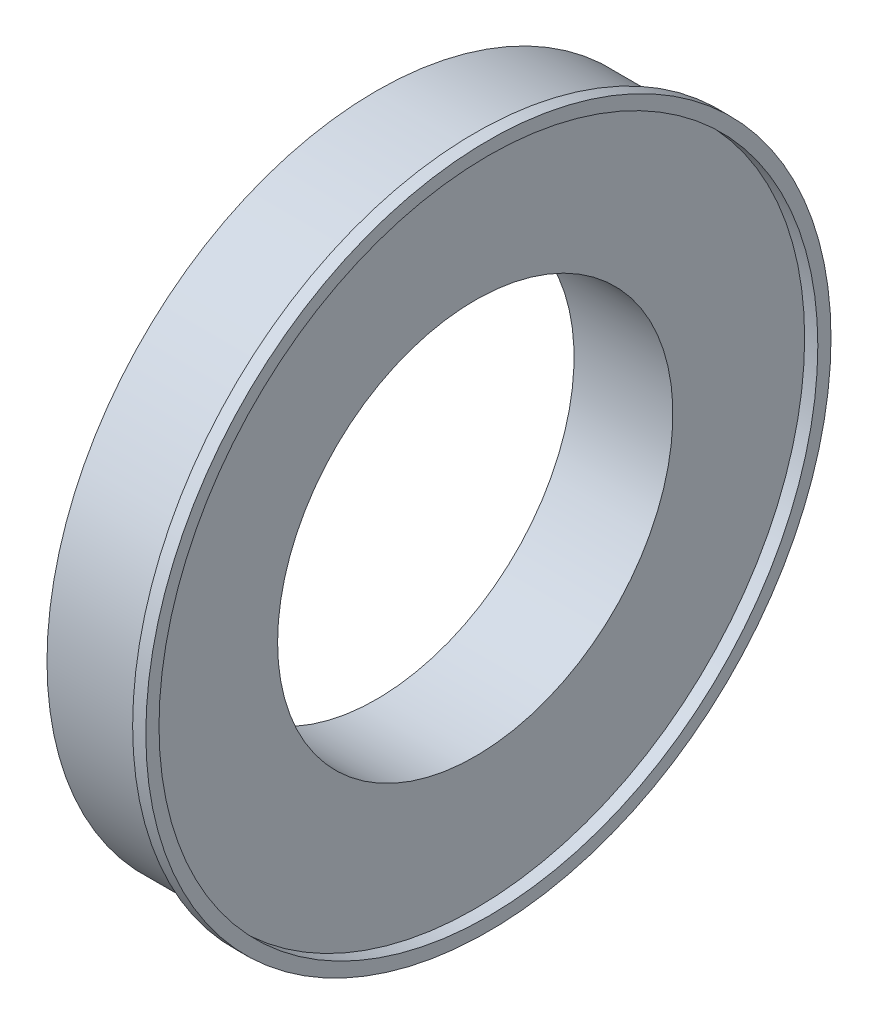
ISO-10303-21;
HEADER;
FILE_DESCRIPTION(('STEP AP214'),'2;1');
FILE_NAME('part.step','',(''),(''),'','','');
FILE_SCHEMA(('AUTOMOTIVE_DESIGN { 1 0 10303 214 1 1 1 1 }'));
ENDSEC;
DATA;
#1=APPLICATION_CONTEXT('core data for automotive mechanical design processes');
#2=APPLICATION_PROTOCOL_DEFINITION('international standard','automotive_design',2000,#1);
#3=PRODUCT_CONTEXT('',#1,'mechanical');
#4=PRODUCT('Part','Part','',(#3));
#5=PRODUCT_RELATED_PRODUCT_CATEGORY('part','',(#4));
#6=PRODUCT_DEFINITION_FORMATION('','',#4);
#7=PRODUCT_DEFINITION_CONTEXT('part definition',#1,'design');
#8=PRODUCT_DEFINITION('design','',#6,#7);
#9=PRODUCT_DEFINITION_SHAPE('','',#8);
#10=(LENGTH_UNIT() NAMED_UNIT(*) SI_UNIT(.MILLI.,.METRE.));
#11=(NAMED_UNIT(*) PLANE_ANGLE_UNIT() SI_UNIT($,.RADIAN.));
#12=(NAMED_UNIT(*) SI_UNIT($,.STERADIAN.) SOLID_ANGLE_UNIT());
#13=UNCERTAINTY_MEASURE_WITH_UNIT(LENGTH_MEASURE(1.E-05),#10,'distance_accuracy_value','');
#14=(GEOMETRIC_REPRESENTATION_CONTEXT(3) GLOBAL_UNCERTAINTY_ASSIGNED_CONTEXT((#13)) GLOBAL_UNIT_ASSIGNED_CONTEXT((#10,
#11,#12)) REPRESENTATION_CONTEXT('',''));
#15=CARTESIAN_POINT('',(0.,0.,0.));
#16=DIRECTION('',(0.,0.,1.));
#17=DIRECTION('',(1.,0.,0.));
#18=AXIS2_PLACEMENT_3D('',#15,#16,#17);
#19=CARTESIAN_POINT('',(21.59,0.,0.));
#20=DIRECTION('',(1.,0.,0.));
#21=DIRECTION('',(0.,0.,-1.));
#22=AXIS2_PLACEMENT_3D('',#19,#20,#21);
#23=PLANE('',#22);
#24=CARTESIAN_POINT('',(21.59,0.,0.));
#25=DIRECTION('',(1.,0.,0.));
#26=DIRECTION('',(0.,0.,-1.));
#27=AXIS2_PLACEMENT_3D('',#24,#25,#26);
#28=CIRCLE('',#27,66.04);
#29=CARTESIAN_POINT('',(21.59,0.,-66.04));
#30=VERTEX_POINT('',#29);
#31=EDGE_CURVE('E11',#30,#30,#28,.T.);
#32=ORIENTED_EDGE('',*,*,#31,.T.);
#33=EDGE_LOOP('',(#32));
#34=FACE_BOUND('',#33,.T.);
#35=CARTESIAN_POINT('',(21.59,0.,0.));
#36=DIRECTION('',(1.,0.,0.));
#37=DIRECTION('',(0.,0.,-1.));
#38=AXIS2_PLACEMENT_3D('',#35,#36,#37);
#39=CIRCLE('',#38,63.5);
#40=CARTESIAN_POINT('',(21.59,0.,-63.5));
#41=VERTEX_POINT('',#40);
#42=EDGE_CURVE('E54',#41,#41,#39,.T.);
#43=ORIENTED_EDGE('',*,*,#42,.F.);
#44=EDGE_LOOP('',(#43));
#45=FACE_BOUND('',#44,.T.);
#46=ADVANCED_FACE('F43',(#34,#45),#23,.T.);
#47=CARTESIAN_POINT('',(19.05,0.,0.));
#48=DIRECTION('',(1.,0.,0.));
#49=DIRECTION('',(0.,0.,-1.));
#50=AXIS2_PLACEMENT_3D('',#47,#48,#49);
#51=PLANE('',#50);
#52=CARTESIAN_POINT('',(19.05,0.,0.));
#53=DIRECTION('',(1.,0.,0.));
#54=DIRECTION('',(0.,0.,-1.));
#55=AXIS2_PLACEMENT_3D('',#52,#53,#54);
#56=CIRCLE('',#55,66.04);
#57=CARTESIAN_POINT('',(19.05,0.,-66.04));
#58=VERTEX_POINT('',#57);
#59=EDGE_CURVE('E47',#58,#58,#56,.T.);
#60=ORIENTED_EDGE('',*,*,#59,.F.);
#61=EDGE_LOOP('',(#60));
#62=FACE_BOUND('',#61,.T.);
#63=CARTESIAN_POINT('',(19.05,0.,0.));
#64=DIRECTION('',(1.,0.,0.));
#65=DIRECTION('',(0.,0.,-1.));
#66=AXIS2_PLACEMENT_3D('',#63,#64,#65);
#67=CIRCLE('',#66,63.5);
#68=CARTESIAN_POINT('',(19.05,0.,-63.5));
#69=VERTEX_POINT('',#68);
#70=EDGE_CURVE('E56',#69,#69,#67,.T.);
#71=ORIENTED_EDGE('',*,*,#70,.T.);
#72=EDGE_LOOP('',(#71));
#73=FACE_BOUND('',#72,.T.);
#74=ADVANCED_FACE('F66',(#62,#73),#51,.F.);
#75=CARTESIAN_POINT('',(21.59,0.,0.));
#76=DIRECTION('',(-1.,0.,0.));
#77=DIRECTION('',(0.,0.,1.));
#78=AXIS2_PLACEMENT_3D('',#75,#76,#77);
#79=CYLINDRICAL_SURFACE('',#78,66.04);
#80=ORIENTED_EDGE('',*,*,#31,.F.);
#81=EDGE_LOOP('',(#80));
#82=FACE_BOUND('',#81,.T.);
#83=ORIENTED_EDGE('',*,*,#59,.T.);
#84=EDGE_LOOP('',(#83));
#85=FACE_BOUND('',#84,.T.);
#86=ADVANCED_FACE('F45',(#82,#85),#79,.T.);
#87=CARTESIAN_POINT('',(21.59,0.,0.));
#88=DIRECTION('',(-1.,0.,0.));
#89=DIRECTION('',(0.,0.,1.));
#90=AXIS2_PLACEMENT_3D('',#87,#88,#89);
#91=CYLINDRICAL_SURFACE('',#90,63.5);
#92=ORIENTED_EDGE('',*,*,#42,.T.);
#93=EDGE_LOOP('',(#92));
#94=FACE_BOUND('',#93,.T.);
#95=ORIENTED_EDGE('',*,*,#70,.F.);
#96=EDGE_LOOP('',(#95));
#97=FACE_BOUND('',#96,.T.);
#98=ADVANCED_FACE('F62',(#94,#97),#91,.F.);
#99=CLOSED_SHELL('',(#46,#74,#86,#98));
#100=MANIFOLD_SOLID_BREP('B2',#99);
#101=CARTESIAN_POINT('',(19.05,0.,0.));
#102=DIRECTION('',(1.,0.,0.));
#103=DIRECTION('',(0.,0.,-1.));
#104=AXIS2_PLACEMENT_3D('',#101,#102,#103);
#105=PLANE('',#104);
#106=CARTESIAN_POINT('',(19.05,0.,0.));
#107=DIRECTION('',(1.,0.,0.));
#108=DIRECTION('',(0.,0.,-1.));
#109=AXIS2_PLACEMENT_3D('',#106,#107,#108);
#110=CIRCLE('',#109,63.5);
#111=CARTESIAN_POINT('',(19.05,0.,63.5));
#112=VERTEX_POINT('',#111);
#113=EDGE_CURVE('E42',#112,#112,#110,.T.);
#114=ORIENTED_EDGE('',*,*,#113,.T.);
#115=EDGE_LOOP('',(#114));
#116=FACE_BOUND('',#115,.T.);
#117=CARTESIAN_POINT('',(19.05,0.,0.));
#118=DIRECTION('',(1.,0.,0.));
#119=DIRECTION('',(0.,0.,-1.));
#120=AXIS2_PLACEMENT_3D('',#117,#118,#119);
#121=CIRCLE('',#120,38.1);
#122=CARTESIAN_POINT('',(19.05,0.,38.1));
#123=VERTEX_POINT('',#122);
#124=EDGE_CURVE('E118',#123,#123,#121,.T.);
#125=ORIENTED_EDGE('',*,*,#124,.F.);
#126=EDGE_LOOP('',(#125));
#127=FACE_BOUND('',#126,.T.);
#128=ADVANCED_FACE('F107',(#116,#127),#105,.T.);
#129=CARTESIAN_POINT('',(0.,0.,0.));
#130=DIRECTION('',(1.,0.,0.));
#131=DIRECTION('',(0.,0.,-1.));
#132=AXIS2_PLACEMENT_3D('',#129,#130,#131);
#133=PLANE('',#132);
#134=CARTESIAN_POINT('',(0.,0.,0.));
#135=DIRECTION('',(1.,0.,0.));
#136=DIRECTION('',(0.,0.,-1.));
#137=AXIS2_PLACEMENT_3D('',#134,#135,#136);
#138=CIRCLE('',#137,63.5);
#139=CARTESIAN_POINT('',(0.,0.,63.5));
#140=VERTEX_POINT('',#139);
#141=EDGE_CURVE('E111',#140,#140,#138,.T.);
#142=ORIENTED_EDGE('',*,*,#141,.F.);
#143=EDGE_LOOP('',(#142));
#144=FACE_BOUND('',#143,.T.);
#145=CARTESIAN_POINT('',(0.,0.,0.));
#146=DIRECTION('',(1.,0.,0.));
#147=DIRECTION('',(0.,0.,-1.));
#148=AXIS2_PLACEMENT_3D('',#145,#146,#147);
#149=CIRCLE('',#148,38.1);
#150=CARTESIAN_POINT('',(0.,0.,38.1));
#151=VERTEX_POINT('',#150);
#152=EDGE_CURVE('E120',#151,#151,#149,.T.);
#153=ORIENTED_EDGE('',*,*,#152,.T.);
#154=EDGE_LOOP('',(#153));
#155=FACE_BOUND('',#154,.T.);
#156=ADVANCED_FACE('F130',(#144,#155),#133,.F.);
#157=CARTESIAN_POINT('',(19.05,0.,0.));
#158=DIRECTION('',(-1.,0.,0.));
#159=DIRECTION('',(0.,0.,1.));
#160=AXIS2_PLACEMENT_3D('',#157,#158,#159);
#161=CYLINDRICAL_SURFACE('',#160,63.5);
#162=CARTESIAN_POINT('',(19.05,0.,63.5));
#163=CARTESIAN_POINT('',(18.8515625,0.,63.5));
#164=CARTESIAN_POINT('',(18.653125,0.,63.5));
#165=CARTESIAN_POINT('',(18.25625,0.,63.5));
#166=CARTESIAN_POINT('',(18.0578125,0.,63.5));
#167=CARTESIAN_POINT('',(17.6609375,0.,63.5));
#168=CARTESIAN_POINT('',(17.4625,0.,63.5));
#169=CARTESIAN_POINT('',(17.065625,0.,63.5));
#170=CARTESIAN_POINT('',(16.8671875,0.,63.5));
#171=CARTESIAN_POINT('',(16.4703125,0.,63.5));
#172=CARTESIAN_POINT('',(16.271875,0.,63.5));
#173=CARTESIAN_POINT('',(15.875,0.,63.5));
#174=CARTESIAN_POINT('',(15.6765625,0.,63.5));
#175=CARTESIAN_POINT('',(15.2796875,0.,63.5));
#176=CARTESIAN_POINT('',(15.08125,0.,63.5));
#177=CARTESIAN_POINT('',(14.684375,0.,63.5));
#178=CARTESIAN_POINT('',(14.4859375,0.,63.5));
#179=CARTESIAN_POINT('',(14.0890625,0.,63.5));
#180=CARTESIAN_POINT('',(13.890625,0.,63.5));
#181=CARTESIAN_POINT('',(13.49375,0.,63.5));
#182=CARTESIAN_POINT('',(13.2953125,0.,63.5));
#183=CARTESIAN_POINT('',(12.8984375,0.,63.5));
#184=CARTESIAN_POINT('',(12.7,0.,63.5));
#185=CARTESIAN_POINT('',(12.303125,0.,63.5));
#186=CARTESIAN_POINT('',(12.1046875,0.,63.5));
#187=CARTESIAN_POINT('',(11.7078125,0.,63.5));
#188=CARTESIAN_POINT('',(11.509375,0.,63.5));
#189=CARTESIAN_POINT('',(11.1125,0.,63.5));
#190=CARTESIAN_POINT('',(10.9140625,0.,63.5));
#191=CARTESIAN_POINT('',(10.5171875,0.,63.5));
#192=CARTESIAN_POINT('',(10.31875,0.,63.5));
#193=CARTESIAN_POINT('',(9.921875,0.,63.5));
#194=CARTESIAN_POINT('',(9.7234375,0.,63.5));
#195=CARTESIAN_POINT('',(9.3265625,0.,63.5));
#196=CARTESIAN_POINT('',(9.128125,0.,63.5));
#197=CARTESIAN_POINT('',(8.73125,0.,63.5));
#198=CARTESIAN_POINT('',(8.5328125,0.,63.5));
#199=CARTESIAN_POINT('',(8.1359375,0.,63.5));
#200=CARTESIAN_POINT('',(7.9375,0.,63.5));
#201=CARTESIAN_POINT('',(7.540625,0.,63.5));
#202=CARTESIAN_POINT('',(7.3421875,0.,63.5));
#203=CARTESIAN_POINT('',(6.9453125,0.,63.5));
#204=CARTESIAN_POINT('',(6.746875,0.,63.5));
#205=CARTESIAN_POINT('',(6.35,0.,63.5));
#206=CARTESIAN_POINT('',(6.1515625,0.,63.5));
#207=CARTESIAN_POINT('',(5.7546875,0.,63.5));
#208=CARTESIAN_POINT('',(5.55625,0.,63.5));
#209=CARTESIAN_POINT('',(5.159375,0.,63.5));
#210=CARTESIAN_POINT('',(4.9609375,0.,63.5));
#211=CARTESIAN_POINT('',(4.5640625,0.,63.5));
#212=CARTESIAN_POINT('',(4.365625,0.,63.5));
#213=CARTESIAN_POINT('',(3.96875,0.,63.5));
#214=CARTESIAN_POINT('',(3.7703125,0.,63.5));
#215=CARTESIAN_POINT('',(3.3734375,0.,63.5));
#216=CARTESIAN_POINT('',(3.175,0.,63.5));
#217=CARTESIAN_POINT('',(2.778125,0.,63.5));
#218=CARTESIAN_POINT('',(2.5796875,0.,63.5));
#219=CARTESIAN_POINT('',(2.1828125,0.,63.5));
#220=CARTESIAN_POINT('',(1.984375,0.,63.5));
#221=CARTESIAN_POINT('',(1.5875,0.,63.5));
#222=CARTESIAN_POINT('',(1.3890625,0.,63.5));
#223=CARTESIAN_POINT('',(0.992187500000001,0.,63.5));
#224=CARTESIAN_POINT('',(0.793750000000001,0.,63.5));
#225=CARTESIAN_POINT('',(0.396875,0.,63.5));
#226=CARTESIAN_POINT('',(0.1984375,0.,63.5));
#227=CARTESIAN_POINT('',(0.,0.,63.5));
#228=B_SPLINE_CURVE_WITH_KNOTS('',3,(#162,#163,#164,#165,#166,#167,#168,#169,#170,#171,#172,
#173,#174,#175,#176,#177,#178,#179,#180,#181,#182,#183,#184,#185,#186,#187,#188,#189,#190,#191,
#192,#193,#194,#195,#196,#197,#198,#199,#200,#201,#202,#203,#204,#205,#206,#207,#208,#209,#210,
#211,#212,#213,#214,#215,#216,#217,#218,#219,#220,#221,#222,#223,#224,#225,#226,#227),
.UNSPECIFIED.,.F.,.F.,(4,2,2,2,2,2,2,2,2,2,2,2,2,2,2,2,2,2,2,2,2,2,2,2,2,2,2,2,2,2,2,2,4),(0.,
0.5953125,1.190625,1.7859375,2.38125,2.9765625,3.571875,4.1671875,4.7625,5.3578125,5.953125,
6.5484375,7.14375,7.7390625,8.334375,8.9296875,9.525,10.1203125,10.715625,11.3109375,11.90625,
12.5015625,13.096875,13.6921875,14.2875,14.8828125,15.478125,16.0734375,16.66875,17.2640625,
17.859375,18.4546875,19.05),.UNSPECIFIED.);
#229=EDGE_CURVE('BSEAM109',#112,#140,#228,.T.);
#230=ORIENTED_EDGE('',*,*,#113,.F.);
#231=ORIENTED_EDGE('',*,*,#141,.T.);
#232=ORIENTED_EDGE('',*,*,#229,.T.);
#233=ORIENTED_EDGE('',*,*,#229,.F.);
#234=EDGE_LOOP('',(#230,#232,#231,#233));
#235=FACE_BOUND('',#234,.T.);
#236=ADVANCED_FACE('F109',(#235),#161,.T.);
#237=CARTESIAN_POINT('',(19.05,0.,0.));
#238=DIRECTION('',(-1.,0.,0.));
#239=DIRECTION('',(0.,0.,1.));
#240=AXIS2_PLACEMENT_3D('',#237,#238,#239);
#241=CYLINDRICAL_SURFACE('',#240,38.1);
#242=CARTESIAN_POINT('',(19.05,0.,38.1));
#243=CARTESIAN_POINT('',(18.8515625,0.,38.1));
#244=CARTESIAN_POINT('',(18.653125,0.,38.1));
#245=CARTESIAN_POINT('',(18.25625,0.,38.1));
#246=CARTESIAN_POINT('',(18.0578125,0.,38.1));
#247=CARTESIAN_POINT('',(17.6609375,0.,38.1));
#248=CARTESIAN_POINT('',(17.4625,0.,38.1));
#249=CARTESIAN_POINT('',(17.065625,0.,38.1));
#250=CARTESIAN_POINT('',(16.8671875,0.,38.1));
#251=CARTESIAN_POINT('',(16.4703125,0.,38.1));
#252=CARTESIAN_POINT('',(16.271875,0.,38.1));
#253=CARTESIAN_POINT('',(15.875,0.,38.1));
#254=CARTESIAN_POINT('',(15.6765625,0.,38.1));
#255=CARTESIAN_POINT('',(15.2796875,0.,38.1));
#256=CARTESIAN_POINT('',(15.08125,0.,38.1));
#257=CARTESIAN_POINT('',(14.684375,0.,38.1));
#258=CARTESIAN_POINT('',(14.4859375,0.,38.1));
#259=CARTESIAN_POINT('',(14.0890625,0.,38.1));
#260=CARTESIAN_POINT('',(13.890625,0.,38.1));
#261=CARTESIAN_POINT('',(13.49375,0.,38.1));
#262=CARTESIAN_POINT('',(13.2953125,0.,38.1));
#263=CARTESIAN_POINT('',(12.8984375,0.,38.1));
#264=CARTESIAN_POINT('',(12.7,0.,38.1));
#265=CARTESIAN_POINT('',(12.303125,0.,38.1));
#266=CARTESIAN_POINT('',(12.1046875,0.,38.1));
#267=CARTESIAN_POINT('',(11.7078125,0.,38.1));
#268=CARTESIAN_POINT('',(11.509375,0.,38.1));
#269=CARTESIAN_POINT('',(11.1125,0.,38.1));
#270=CARTESIAN_POINT('',(10.9140625,0.,38.1));
#271=CARTESIAN_POINT('',(10.5171875,0.,38.1));
#272=CARTESIAN_POINT('',(10.31875,0.,38.1));
#273=CARTESIAN_POINT('',(9.921875,0.,38.1));
#274=CARTESIAN_POINT('',(9.7234375,0.,38.1));
#275=CARTESIAN_POINT('',(9.3265625,0.,38.1));
#276=CARTESIAN_POINT('',(9.128125,0.,38.1));
#277=CARTESIAN_POINT('',(8.73125,0.,38.1));
#278=CARTESIAN_POINT('',(8.5328125,0.,38.1));
#279=CARTESIAN_POINT('',(8.1359375,0.,38.1));
#280=CARTESIAN_POINT('',(7.9375,0.,38.1));
#281=CARTESIAN_POINT('',(7.540625,0.,38.1));
#282=CARTESIAN_POINT('',(7.3421875,0.,38.1));
#283=CARTESIAN_POINT('',(6.9453125,0.,38.1));
#284=CARTESIAN_POINT('',(6.746875,0.,38.1));
#285=CARTESIAN_POINT('',(6.35,0.,38.1));
#286=CARTESIAN_POINT('',(6.1515625,0.,38.1));
#287=CARTESIAN_POINT('',(5.7546875,0.,38.1));
#288=CARTESIAN_POINT('',(5.55625,0.,38.1));
#289=CARTESIAN_POINT('',(5.159375,0.,38.1));
#290=CARTESIAN_POINT('',(4.9609375,0.,38.1));
#291=CARTESIAN_POINT('',(4.5640625,0.,38.1));
#292=CARTESIAN_POINT('',(4.365625,0.,38.1));
#293=CARTESIAN_POINT('',(3.96875,0.,38.1));
#294=CARTESIAN_POINT('',(3.7703125,0.,38.1));
#295=CARTESIAN_POINT('',(3.3734375,0.,38.1));
#296=CARTESIAN_POINT('',(3.175,0.,38.1));
#297=CARTESIAN_POINT('',(2.778125,0.,38.1));
#298=CARTESIAN_POINT('',(2.5796875,0.,38.1));
#299=CARTESIAN_POINT('',(2.1828125,0.,38.1));
#300=CARTESIAN_POINT('',(1.984375,0.,38.1));
#301=CARTESIAN_POINT('',(1.5875,0.,38.1));
#302=CARTESIAN_POINT('',(1.3890625,0.,38.1));
#303=CARTESIAN_POINT('',(0.992187500000001,0.,38.1));
#304=CARTESIAN_POINT('',(0.793750000000001,0.,38.1));
#305=CARTESIAN_POINT('',(0.396875,0.,38.1));
#306=CARTESIAN_POINT('',(0.1984375,0.,38.1));
#307=CARTESIAN_POINT('',(0.,0.,38.1));
#308=B_SPLINE_CURVE_WITH_KNOTS('',3,(#242,#243,#244,#245,#246,#247,#248,#249,#250,#251,#252,
#253,#254,#255,#256,#257,#258,#259,#260,#261,#262,#263,#264,#265,#266,#267,#268,#269,#270,#271,
#272,#273,#274,#275,#276,#277,#278,#279,#280,#281,#282,#283,#284,#285,#286,#287,#288,#289,#290,
#291,#292,#293,#294,#295,#296,#297,#298,#299,#300,#301,#302,#303,#304,#305,#306,#307),
.UNSPECIFIED.,.F.,.F.,(4,2,2,2,2,2,2,2,2,2,2,2,2,2,2,2,2,2,2,2,2,2,2,2,2,2,2,2,2,2,2,2,4),(0.,
0.5953125,1.190625,1.7859375,2.38125,2.9765625,3.571875,4.1671875,4.7625,5.3578125,5.953125,
6.5484375,7.14375,7.7390625,8.334375,8.9296875,9.525,10.1203125,10.715625,11.3109375,11.90625,
12.5015625,13.096875,13.6921875,14.2875,14.8828125,15.478125,16.0734375,16.66875,17.2640625,
17.859375,18.4546875,19.05),.UNSPECIFIED.);
#309=EDGE_CURVE('BSEAM126',#123,#151,#308,.T.);
#310=ORIENTED_EDGE('',*,*,#124,.T.);
#311=ORIENTED_EDGE('',*,*,#152,.F.);
#312=ORIENTED_EDGE('',*,*,#309,.T.);
#313=ORIENTED_EDGE('',*,*,#309,.F.);
#314=EDGE_LOOP('',(#310,#312,#311,#313));
#315=FACE_BOUND('',#314,.T.);
#316=ADVANCED_FACE('F126',(#315),#241,.F.);
#317=CLOSED_SHELL('',(#128,#156,#236,#316));
#318=MANIFOLD_SOLID_BREP('B6',#317);
#319=ADVANCED_BREP_SHAPE_REPRESENTATION('',(#18,#100,#318),#14);
#320=SHAPE_DEFINITION_REPRESENTATION(#9,#319);
ENDSEC;
END-ISO-10303-21;
